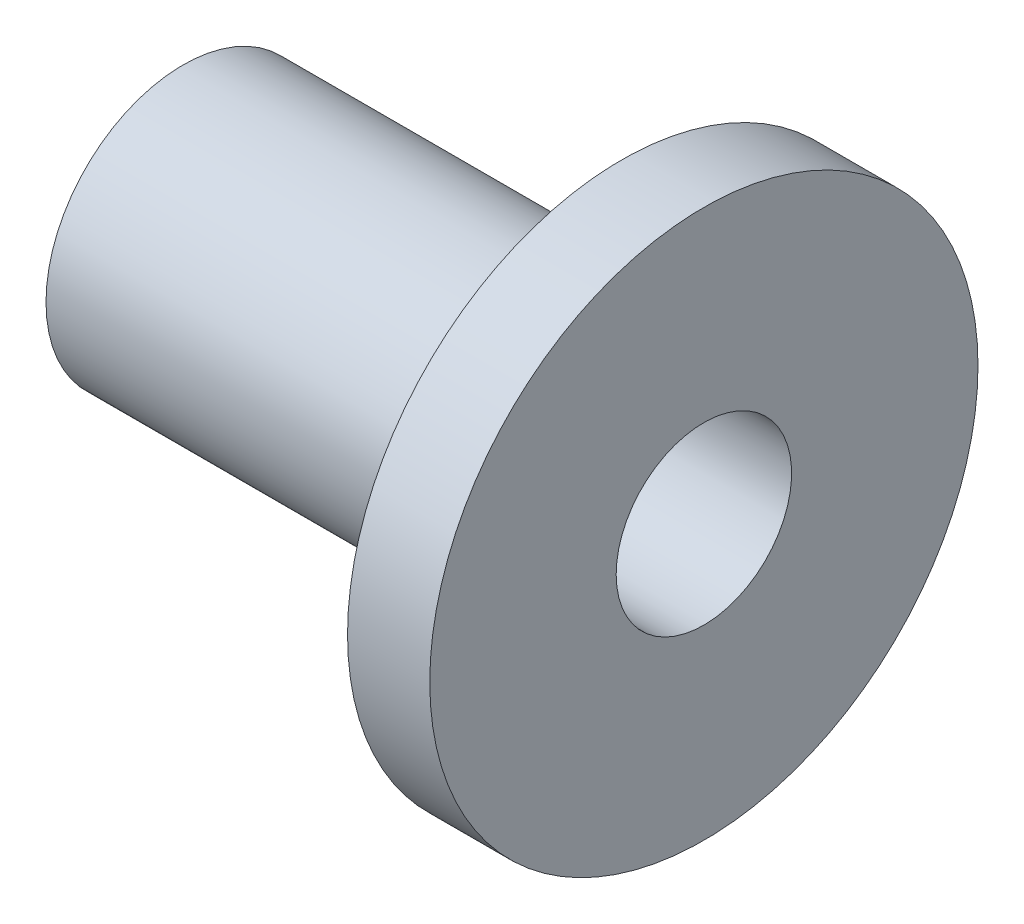
ISO-10303-21;
HEADER;
FILE_DESCRIPTION(('STEP AP214'),'2;1');
FILE_NAME('part.step','',(''),(''),'','','');
FILE_SCHEMA(('AUTOMOTIVE_DESIGN { 1 0 10303 214 1 1 1 1 }'));
ENDSEC;
DATA;
#1=APPLICATION_CONTEXT('core data for automotive mechanical design processes');
#2=APPLICATION_PROTOCOL_DEFINITION('international standard','automotive_design',2000,#1);
#3=PRODUCT_CONTEXT('',#1,'mechanical');
#4=PRODUCT('Part','Part','',(#3));
#5=PRODUCT_RELATED_PRODUCT_CATEGORY('part','',(#4));
#6=PRODUCT_DEFINITION_FORMATION('','',#4);
#7=PRODUCT_DEFINITION_CONTEXT('part definition',#1,'design');
#8=PRODUCT_DEFINITION('design','',#6,#7);
#9=PRODUCT_DEFINITION_SHAPE('','',#8);
#10=(LENGTH_UNIT() NAMED_UNIT(*) SI_UNIT(.MILLI.,.METRE.));
#11=(NAMED_UNIT(*) PLANE_ANGLE_UNIT() SI_UNIT($,.RADIAN.));
#12=(NAMED_UNIT(*) SI_UNIT($,.STERADIAN.) SOLID_ANGLE_UNIT());
#13=UNCERTAINTY_MEASURE_WITH_UNIT(LENGTH_MEASURE(1.E-05),#10,'distance_accuracy_value','');
#14=(GEOMETRIC_REPRESENTATION_CONTEXT(3) GLOBAL_UNCERTAINTY_ASSIGNED_CONTEXT((#13)) GLOBAL_UNIT_ASSIGNED_CONTEXT((#10,
#11,#12)) REPRESENTATION_CONTEXT('',''));
#15=CARTESIAN_POINT('',(0.,0.,0.));
#16=DIRECTION('',(0.,0.,1.));
#17=DIRECTION('',(1.,0.,0.));
#18=AXIS2_PLACEMENT_3D('',#15,#16,#17);
#19=CARTESIAN_POINT('',(0.,0.,0.));
#20=DIRECTION('',(-1.,0.,0.));
#21=DIRECTION('',(0.,0.,1.));
#22=AXIS2_PLACEMENT_3D('',#19,#20,#21);
#23=PLANE('',#22);
#24=CARTESIAN_POINT('',(0.,0.,0.));
#25=DIRECTION('',(-1.,0.,0.));
#26=DIRECTION('',(0.,0.,1.));
#27=AXIS2_PLACEMENT_3D('',#24,#25,#26);
#28=CIRCLE('',#27,2.5);
#29=CARTESIAN_POINT('',(0.,0.,2.5));
#30=VERTEX_POINT('',#29);
#31=EDGE_CURVE('E66',#30,#30,#28,.T.);
#32=ORIENTED_EDGE('',*,*,#31,.T.);
#33=EDGE_LOOP('',(#32));
#34=FACE_BOUND('',#33,.T.);
#35=CARTESIAN_POINT('',(0.,0.,0.));
#36=DIRECTION('',(-1.,0.,0.));
#37=DIRECTION('',(0.,0.,1.));
#38=AXIS2_PLACEMENT_3D('',#35,#36,#37);
#39=CIRCLE('',#38,1.6);
#40=CARTESIAN_POINT('',(0.,0.,1.6));
#41=VERTEX_POINT('',#40);
#42=EDGE_CURVE('E10',#41,#41,#39,.T.);
#43=ORIENTED_EDGE('',*,*,#42,.F.);
#44=EDGE_LOOP('',(#43));
#45=FACE_BOUND('',#44,.T.);
#46=ADVANCED_FACE('F39',(#34,#45),#23,.T.);
#47=CARTESIAN_POINT('',(0.,0.,0.));
#48=DIRECTION('',(-1.,0.,0.));
#49=DIRECTION('',(0.,0.,1.));
#50=AXIS2_PLACEMENT_3D('',#47,#48,#49);
#51=CYLINDRICAL_SURFACE('',#50,1.6);
#52=CARTESIAN_POINT('',(9.5,0.,0.));
#53=DIRECTION('',(-1.,0.,0.));
#54=DIRECTION('',(0.,0.,1.));
#55=AXIS2_PLACEMENT_3D('',#52,#53,#54);
#56=CIRCLE('',#55,1.6);
#57=CARTESIAN_POINT('',(9.5,0.,1.6));
#58=VERTEX_POINT('',#57);
#59=EDGE_CURVE('E46',#58,#58,#56,.T.);
#60=ORIENTED_EDGE('',*,*,#59,.F.);
#61=EDGE_LOOP('',(#60));
#62=FACE_BOUND('',#61,.T.);
#63=ORIENTED_EDGE('',*,*,#42,.T.);
#64=EDGE_LOOP('',(#63));
#65=FACE_BOUND('',#64,.T.);
#66=ADVANCED_FACE('F85',(#62,#65),#51,.F.);
#67=CARTESIAN_POINT('',(9.5,0.,0.));
#68=DIRECTION('',(-1.,0.,0.));
#69=DIRECTION('',(0.,0.,1.));
#70=AXIS2_PLACEMENT_3D('',#67,#68,#69);
#71=PLANE('',#70);
#72=CARTESIAN_POINT('',(9.5,0.,0.));
#73=DIRECTION('',(-1.,0.,0.));
#74=DIRECTION('',(0.,0.,1.));
#75=AXIS2_PLACEMENT_3D('',#72,#73,#74);
#76=CIRCLE('',#75,5.);
#77=CARTESIAN_POINT('',(9.5,0.,5.));
#78=VERTEX_POINT('',#77);
#79=EDGE_CURVE('E51',#78,#78,#76,.T.);
#80=ORIENTED_EDGE('',*,*,#79,.F.);
#81=EDGE_LOOP('',(#80));
#82=FACE_BOUND('',#81,.T.);
#83=ORIENTED_EDGE('',*,*,#59,.T.);
#84=EDGE_LOOP('',(#83));
#85=FACE_BOUND('',#84,.T.);
#86=ADVANCED_FACE('F89',(#82,#85),#71,.F.);
#87=CARTESIAN_POINT('',(0.,0.,0.));
#88=DIRECTION('',(-1.,0.,0.));
#89=DIRECTION('',(0.,0.,1.));
#90=AXIS2_PLACEMENT_3D('',#87,#88,#89);
#91=CYLINDRICAL_SURFACE('',#90,5.);
#92=CARTESIAN_POINT('',(8.,0.,0.));
#93=DIRECTION('',(-1.,0.,0.));
#94=DIRECTION('',(0.,0.,1.));
#95=AXIS2_PLACEMENT_3D('',#92,#93,#94);
#96=CIRCLE('',#95,5.);
#97=CARTESIAN_POINT('',(8.,0.,5.));
#98=VERTEX_POINT('',#97);
#99=EDGE_CURVE('E56',#98,#98,#96,.T.);
#100=ORIENTED_EDGE('',*,*,#99,.F.);
#101=EDGE_LOOP('',(#100));
#102=FACE_BOUND('',#101,.T.);
#103=ORIENTED_EDGE('',*,*,#79,.T.);
#104=EDGE_LOOP('',(#103));
#105=FACE_BOUND('',#104,.T.);
#106=ADVANCED_FACE('F81',(#102,#105),#91,.T.);
#107=CARTESIAN_POINT('',(8.,0.,0.));
#108=DIRECTION('',(-1.,0.,0.));
#109=DIRECTION('',(0.,0.,1.));
#110=AXIS2_PLACEMENT_3D('',#107,#108,#109);
#111=PLANE('',#110);
#112=ORIENTED_EDGE('',*,*,#99,.T.);
#113=EDGE_LOOP('',(#112));
#114=FACE_BOUND('',#113,.T.);
#115=CARTESIAN_POINT('',(8.,0.,0.));
#116=DIRECTION('',(-1.,0.,0.));
#117=DIRECTION('',(0.,0.,1.));
#118=AXIS2_PLACEMENT_3D('',#115,#116,#117);
#119=CIRCLE('',#118,2.5);
#120=CARTESIAN_POINT('',(8.,0.,2.5));
#121=VERTEX_POINT('',#120);
#122=EDGE_CURVE('E62',#121,#121,#119,.T.);
#123=ORIENTED_EDGE('',*,*,#122,.F.);
#124=EDGE_LOOP('',(#123));
#125=FACE_BOUND('',#124,.T.);
#126=ADVANCED_FACE('F75',(#114,#125),#111,.T.);
#127=CARTESIAN_POINT('',(0.,0.,0.));
#128=DIRECTION('',(-1.,0.,0.));
#129=DIRECTION('',(0.,0.,1.));
#130=AXIS2_PLACEMENT_3D('',#127,#128,#129);
#131=CYLINDRICAL_SURFACE('',#130,2.5);
#132=ORIENTED_EDGE('',*,*,#122,.T.);
#133=EDGE_LOOP('',(#132));
#134=FACE_BOUND('',#133,.T.);
#135=ORIENTED_EDGE('',*,*,#31,.F.);
#136=EDGE_LOOP('',(#135));
#137=FACE_BOUND('',#136,.T.);
#138=ADVANCED_FACE('F73',(#134,#137),#131,.T.);
#139=CLOSED_SHELL('',(#46,#66,#86,#106,#126,#138));
#140=MANIFOLD_SOLID_BREP('B2',#139);
#141=ADVANCED_BREP_SHAPE_REPRESENTATION('',(#18,#140),#14);
#142=SHAPE_DEFINITION_REPRESENTATION(#9,#141);
ENDSEC;
END-ISO-10303-21;
